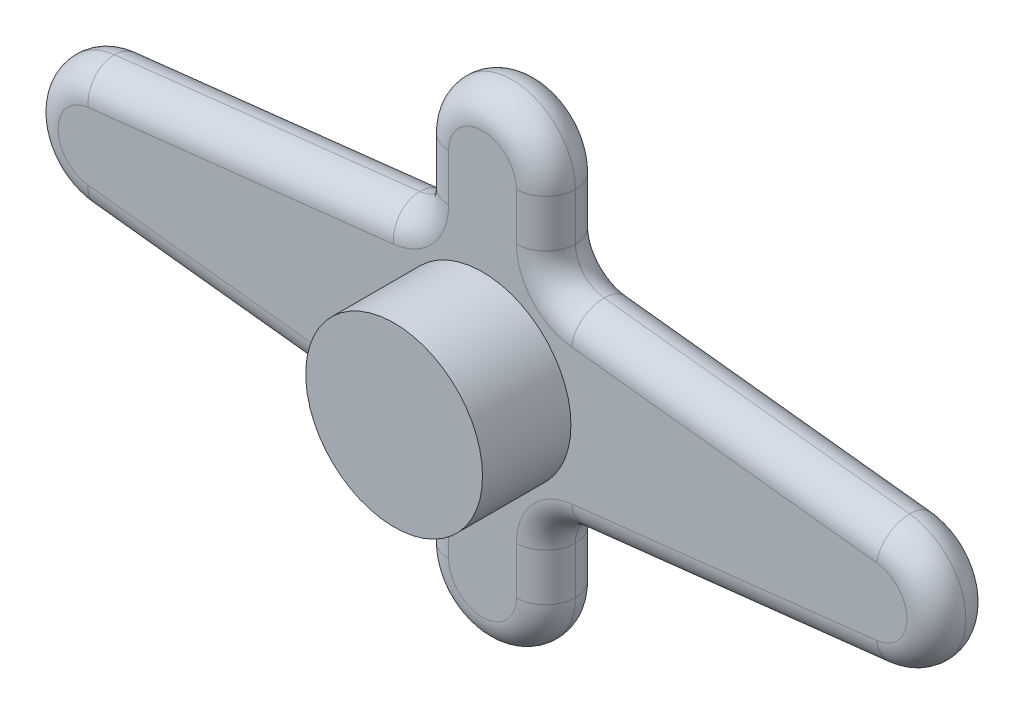
ISO-10303-21;
HEADER;
FILE_DESCRIPTION(('STEP AP214'),'2;1');
FILE_NAME('part.step','',(''),(''),'','','');
FILE_SCHEMA(('AUTOMOTIVE_DESIGN { 1 0 10303 214 1 1 1 1 }'));
ENDSEC;
DATA;
#1=APPLICATION_CONTEXT('core data for automotive mechanical design processes');
#2=APPLICATION_PROTOCOL_DEFINITION('international standard','automotive_design',2000,#1);
#3=PRODUCT_CONTEXT('',#1,'mechanical');
#4=PRODUCT('Part','Part','',(#3));
#5=PRODUCT_RELATED_PRODUCT_CATEGORY('part','',(#4));
#6=PRODUCT_DEFINITION_FORMATION('','',#4);
#7=PRODUCT_DEFINITION_CONTEXT('part definition',#1,'design');
#8=PRODUCT_DEFINITION('design','',#6,#7);
#9=PRODUCT_DEFINITION_SHAPE('','',#8);
#10=(LENGTH_UNIT() NAMED_UNIT(*) SI_UNIT(.MILLI.,.METRE.));
#11=(NAMED_UNIT(*) PLANE_ANGLE_UNIT() SI_UNIT($,.RADIAN.));
#12=(NAMED_UNIT(*) SI_UNIT($,.STERADIAN.) SOLID_ANGLE_UNIT());
#13=UNCERTAINTY_MEASURE_WITH_UNIT(LENGTH_MEASURE(1.E-05),#10,'distance_accuracy_value','');
#14=(GEOMETRIC_REPRESENTATION_CONTEXT(3) GLOBAL_UNCERTAINTY_ASSIGNED_CONTEXT((#13)) GLOBAL_UNIT_ASSIGNED_CONTEXT((#10,
#11,#12)) REPRESENTATION_CONTEXT('',''));
#15=CARTESIAN_POINT('',(0.,0.,0.));
#16=DIRECTION('',(0.,0.,1.));
#17=DIRECTION('',(1.,0.,0.));
#18=AXIS2_PLACEMENT_3D('',#15,#16,#17);
#19=CARTESIAN_POINT('',(675.133867879121,870.80410708692,1309.67784345282));
#20=DIRECTION('',(0.,0.,1.));
#21=DIRECTION('',(1.,0.,0.));
#22=AXIS2_PLACEMENT_3D('',#19,#20,#21);
#23=PLANE('',#22);
#24=DIRECTION('',(-9.12479080608965E-12,-1.,0.));
#25=VECTOR('',#24,1.);
#26=CARTESIAN_POINT('',(677.233867878965,879.591990943889,1309.67784345282));
#27=LINE('',#26,#25);
#28=CARTESIAN_POINT('',(677.233867878979,881.198049015409,1309.67784345282));
#29=VERTEX_POINT('',#28);
#30=CARTESIAN_POINT('',(677.233867878965,879.591990943909,1309.67784345282));
#31=VERTEX_POINT('',#30);
#32=EDGE_CURVE('E354',#29,#31,#27,.T.);
#33=ORIENTED_EDGE('',*,*,#32,.T.);
#34=CARTESIAN_POINT('',(675.133867879001,879.591990943886,1309.67784345282));
#35=DIRECTION('',(0.,0.,1.));
#36=DIRECTION('',(1.,0.,0.));
#37=AXIS2_PLACEMENT_3D('',#34,#35,#36);
#38=CIRCLE('',#37,2.09999999997242);
#39=CARTESIAN_POINT('',(675.368326717869,877.50512030755,1309.67784345282));
#40=VERTEX_POINT('',#39);
#41=EDGE_CURVE('E356',#31,#40,#38,.F.);
#42=ORIENTED_EDGE('',*,*,#41,.T.);
#43=DIRECTION('',(-0.993747922073089,-0.111647066129911,0.));
#44=VECTOR('',#43,1.);
#45=CARTESIAN_POINT('',(665.005473753016,876.340859125652,1309.67784345282));
#46=LINE('',#45,#44);
#47=CARTESIAN_POINT('',(665.005473753014,876.340859125652,1309.67784345282));
#48=VERTEX_POINT('',#47);
#49=EDGE_CURVE('E324',#40,#48,#46,.T.);
#50=ORIENTED_EDGE('',*,*,#49,.T.);
#51=CARTESIAN_POINT('',(665.133867879061,875.198049015267,1309.67784345282));
#52=DIRECTION('',(0.,0.,1.));
#53=DIRECTION('',(1.,0.,0.));
#54=AXIS2_PLACEMENT_3D('',#51,#52,#53);
#55=CIRCLE('',#54,1.15000000000018);
#56=CARTESIAN_POINT('',(665.005473753045,874.055238904879,1309.67784345282));
#57=VERTEX_POINT('',#56);
#58=EDGE_CURVE('E328',#48,#57,#55,.T.);
#59=ORIENTED_EDGE('',*,*,#58,.T.);
#60=DIRECTION('',(0.993747922076312,-0.111647066101228,0.));
#61=VECTOR('',#60,1.);
#62=CARTESIAN_POINT('',(675.368326717933,872.89097772328,1309.67784345282));
#63=LINE('',#62,#61);
#64=CARTESIAN_POINT('',(675.368326717933,872.89097772328,1309.67784345282));
#65=VERTEX_POINT('',#64);
#66=EDGE_CURVE('E330',#57,#65,#63,.T.);
#67=ORIENTED_EDGE('',*,*,#66,.T.);
#68=CARTESIAN_POINT('',(675.133867879121,870.80410708692,1309.67784345282));
#69=DIRECTION('',(0.,0.,1.));
#70=DIRECTION('',(1.,0.,0.));
#71=AXIS2_PLACEMENT_3D('',#68,#69,#70);
#72=CIRCLE('',#71,2.10000000000007);
#73=CARTESIAN_POINT('',(677.233867879121,870.804107086948,1309.67784345282));
#74=VERTEX_POINT('',#73);
#75=EDGE_CURVE('E332',#65,#74,#72,.F.);
#76=ORIENTED_EDGE('',*,*,#75,.T.);
#77=DIRECTION('',(1.32724229907015E-11,-1.,0.));
#78=VECTOR('',#77,1.);
#79=CARTESIAN_POINT('',(677.233867879142,869.198049015431,1309.67784345282));
#80=LINE('',#79,#78);
#81=CARTESIAN_POINT('',(677.233867879142,869.198049015431,1309.67784345282));
#82=VERTEX_POINT('',#81);
#83=EDGE_CURVE('E334',#74,#82,#80,.T.);
#84=ORIENTED_EDGE('',*,*,#83,.T.);
#85=CARTESIAN_POINT('',(678.383867879142,869.198049015447,1309.67784345282));
#86=DIRECTION('',(0.,0.,1.));
#87=DIRECTION('',(1.,0.,0.));
#88=AXIS2_PLACEMENT_3D('',#85,#86,#87);
#89=CIRCLE('',#88,1.1500000000001);
#90=CARTESIAN_POINT('',(679.533867879142,869.198049015468,1309.67784345282));
#91=VERTEX_POINT('',#90);
#92=EDGE_CURVE('E336',#82,#91,#89,.T.);
#93=ORIENTED_EDGE('',*,*,#92,.T.);
#94=DIRECTION('',(-7.88050115068328E-12,1.,0.));
#95=VECTOR('',#94,1.);
#96=CARTESIAN_POINT('',(679.53386787913,870.804107086994,1309.67784345282));
#97=LINE('',#96,#95);
#98=CARTESIAN_POINT('',(679.53386787913,870.804107086997,1309.67784345282));
#99=VERTEX_POINT('',#98);
#100=EDGE_CURVE('E338',#91,#99,#97,.T.);
#101=ORIENTED_EDGE('',*,*,#100,.T.);
#102=CARTESIAN_POINT('',(681.63386787912,870.804107087007,1309.67784345282));
#103=DIRECTION('',(0.,0.,1.));
#104=DIRECTION('',(1.,0.,0.));
#105=AXIS2_PLACEMENT_3D('',#102,#103,#104);
#106=CIRCLE('',#105,2.09999999999465);
#107=CARTESIAN_POINT('',(681.39940904028,872.890977723359,1309.67784345282));
#108=VERTEX_POINT('',#107);
#109=EDGE_CURVE('E340',#99,#108,#106,.F.);
#110=ORIENTED_EDGE('',*,*,#109,.T.);
#111=DIRECTION('',(0.993747922073295,0.11164706612808,0.));
#112=VECTOR('',#111,1.);
#113=CARTESIAN_POINT('',(691.762262005108,874.055238905239,1309.67784345282));
#114=LINE('',#113,#112);
#115=CARTESIAN_POINT('',(691.762262005109,874.055238905239,1309.67784345282));
#116=VERTEX_POINT('',#115);
#117=EDGE_CURVE('E342',#108,#116,#114,.T.);
#118=ORIENTED_EDGE('',*,*,#117,.T.);
#119=CARTESIAN_POINT('',(691.633867879061,875.198049015623,1309.67784345282));
#120=DIRECTION('',(0.,0.,1.));
#121=DIRECTION('',(1.,0.,0.));
#122=AXIS2_PLACEMENT_3D('',#119,#120,#121);
#123=CIRCLE('',#122,1.15000000000016);
#124=CARTESIAN_POINT('',(691.762262005078,876.340859126011,1309.67784345282));
#125=VERTEX_POINT('',#124);
#126=EDGE_CURVE('E344',#116,#125,#123,.T.);
#127=ORIENTED_EDGE('',*,*,#126,.T.);
#128=DIRECTION('',(-0.993747922076275,0.111647066101561,0.));
#129=VECTOR('',#128,1.);
#130=CARTESIAN_POINT('',(681.399409040212,877.505120307611,1309.67784345282));
#131=LINE('',#130,#129);
#132=CARTESIAN_POINT('',(681.399409040233,877.505120307609,1309.67784345282));
#133=VERTEX_POINT('',#132);
#134=EDGE_CURVE('E346',#125,#133,#131,.T.);
#135=ORIENTED_EDGE('',*,*,#134,.T.);
#136=CARTESIAN_POINT('',(681.633867879002,879.591990943973,1309.67784345282));
#137=DIRECTION('',(0.,0.,1.));
#138=DIRECTION('',(1.,0.,0.));
#139=AXIS2_PLACEMENT_3D('',#136,#137,#138);
#140=CIRCLE('',#139,2.09999999999912);
#141=CARTESIAN_POINT('',(679.533867879003,879.591990943943,1309.67784345282));
#142=VERTEX_POINT('',#141);
#143=EDGE_CURVE('E348',#133,#142,#140,.F.);
#144=ORIENTED_EDGE('',*,*,#143,.T.);
#145=DIRECTION('',(-1.45167126460658E-11,1.,0.));
#146=VECTOR('',#145,1.);
#147=CARTESIAN_POINT('',(679.533867878979,881.198049015461,1309.67784345282));
#148=LINE('',#147,#146);
#149=CARTESIAN_POINT('',(679.533867878979,881.198049015462,1309.67784345282));
#150=VERTEX_POINT('',#149);
#151=EDGE_CURVE('E350',#142,#150,#148,.T.);
#152=ORIENTED_EDGE('',*,*,#151,.T.);
#153=CARTESIAN_POINT('',(678.383867878979,881.198049015447,1309.67784345282));
#154=DIRECTION('',(0.,0.,1.));
#155=DIRECTION('',(1.,0.,0.));
#156=AXIS2_PLACEMENT_3D('',#153,#154,#155);
#157=CIRCLE('',#156,1.1500000000001);
#158=EDGE_CURVE('E352',#150,#29,#157,.T.);
#159=ORIENTED_EDGE('',*,*,#158,.T.);
#160=EDGE_LOOP('',(#33,#42,#50,#59,#67,#76,#84,#93,#101,#110,#118,#127,#135,#144,#152,#159));
#161=FACE_BOUND('',#160,.T.);
#162=CARTESIAN_POINT('',(678.383867879061,875.198049015447,1309.67784345282));
#163=DIRECTION('',(0.,0.,1.));
#164=DIRECTION('',(1.,0.,0.));
#165=AXIS2_PLACEMENT_3D('',#162,#163,#164);
#166=CIRCLE('',#165,3.00000000000005);
#167=CARTESIAN_POINT('',(681.383867879061,875.198049015447,1309.67784345282));
#168=VERTEX_POINT('',#167);
#169=EDGE_CURVE('E319',#168,#168,#166,.T.);
#170=ORIENTED_EDGE('',*,*,#169,.F.);
#171=EDGE_LOOP('',(#170));
#172=FACE_BOUND('',#171,.T.);
#173=ADVANCED_FACE('F39',(#161,#172),#23,.T.);
#174=CARTESIAN_POINT('',(675.133867879121,870.80410708692,1307.67784345282));
#175=DIRECTION('',(0.,0.,1.));
#176=DIRECTION('',(1.,0.,0.));
#177=AXIS2_PLACEMENT_3D('',#174,#175,#176);
#178=PLANE('',#177);
#179=DIRECTION('',(-0.993747922073089,-0.111647066129911,0.));
#180=VECTOR('',#179,1.);
#181=CARTESIAN_POINT('',(674.393319440673,877.395578743199,1307.67784345282));
#182=LINE('',#181,#180);
#183=CARTESIAN_POINT('',(665.005473753014,876.340859125652,1307.67784345282));
#184=VERTEX_POINT('',#183);
#185=CARTESIAN_POINT('',(675.368326717869,877.50512030755,1307.67784345282));
#186=VERTEX_POINT('',#185);
#187=EDGE_CURVE('E359',#184,#186,#182,.F.);
#188=ORIENTED_EDGE('',*,*,#187,.T.);
#189=CARTESIAN_POINT('',(675.133867879001,879.591990943886,1307.67784345282));
#190=DIRECTION('',(0.,0.,1.));
#191=DIRECTION('',(1.,0.,0.));
#192=AXIS2_PLACEMENT_3D('',#189,#190,#191);
#193=CIRCLE('',#192,2.09999999997242);
#194=CARTESIAN_POINT('',(677.233867878965,879.591990943909,1307.67784345282));
#195=VERTEX_POINT('',#194);
#196=EDGE_CURVE('E11',#186,#195,#193,.T.);
#197=ORIENTED_EDGE('',*,*,#196,.T.);
#198=DIRECTION('',(-9.12479080608965E-12,-1.,0.));
#199=VECTOR('',#198,1.);
#200=CARTESIAN_POINT('',(677.233867878884,870.804107086901,1307.67784345282));
#201=LINE('',#200,#199);
#202=CARTESIAN_POINT('',(677.233867878979,881.198049015409,1307.67784345282));
#203=VERTEX_POINT('',#202);
#204=EDGE_CURVE('E49',#195,#203,#201,.F.);
#205=ORIENTED_EDGE('',*,*,#204,.T.);
#206=CARTESIAN_POINT('',(678.383867878979,881.198049015447,1307.67784345282));
#207=DIRECTION('',(0.,0.,1.));
#208=DIRECTION('',(1.,0.,0.));
#209=AXIS2_PLACEMENT_3D('',#206,#207,#208);
#210=CIRCLE('',#209,1.1500000000001);
#211=CARTESIAN_POINT('',(679.533867878979,881.198049015462,1307.67784345282));
#212=VERTEX_POINT('',#211);
#213=EDGE_CURVE('E211',#203,#212,#210,.F.);
#214=ORIENTED_EDGE('',*,*,#213,.T.);
#215=DIRECTION('',(-1.45167126460658E-11,1.,0.));
#216=VECTOR('',#215,1.);
#217=CARTESIAN_POINT('',(679.53386787913,870.804107086984,1307.67784345282));
#218=LINE('',#217,#216);
#219=CARTESIAN_POINT('',(679.533867879003,879.591990943943,1307.67784345282));
#220=VERTEX_POINT('',#219);
#221=EDGE_CURVE('E214',#212,#220,#218,.F.);
#222=ORIENTED_EDGE('',*,*,#221,.T.);
#223=CARTESIAN_POINT('',(681.633867879002,879.591990943973,1307.67784345282));
#224=DIRECTION('',(0.,0.,1.));
#225=DIRECTION('',(1.,0.,0.));
#226=AXIS2_PLACEMENT_3D('',#223,#224,#225);
#227=CIRCLE('',#226,2.09999999999912);
#228=CARTESIAN_POINT('',(681.399409040233,877.505120307609,1307.67784345282));
#229=VERTEX_POINT('',#228);
#230=EDGE_CURVE('E227',#220,#229,#227,.T.);
#231=ORIENTED_EDGE('',*,*,#230,.T.);
#232=DIRECTION('',(-0.993747922076275,0.111647066101561,0.));
#233=VECTOR('',#232,1.);
#234=CARTESIAN_POINT('',(675.955439255287,878.116747502929,1307.67784345282));
#235=LINE('',#234,#233);
#236=CARTESIAN_POINT('',(691.762262005078,876.340859126011,1307.67784345282));
#237=VERTEX_POINT('',#236);
#238=EDGE_CURVE('E379',#229,#237,#235,.F.);
#239=ORIENTED_EDGE('',*,*,#238,.T.);
#240=CARTESIAN_POINT('',(691.633867879061,875.198049015623,1307.67784345282));
#241=DIRECTION('',(0.,0.,1.));
#242=DIRECTION('',(1.,0.,0.));
#243=AXIS2_PLACEMENT_3D('',#240,#241,#242);
#244=CIRCLE('',#243,1.15000000000016);
#245=CARTESIAN_POINT('',(691.762262005109,874.055238905239,1307.67784345282));
#246=VERTEX_POINT('',#245);
#247=EDGE_CURVE('E377',#237,#246,#244,.F.);
#248=ORIENTED_EDGE('',*,*,#247,.T.);
#249=DIRECTION('',(0.993747922073295,0.11164706612808,0.));
#250=VECTOR('',#249,1.);
#251=CARTESIAN_POINT('',(674.98043197818,872.169808963551,1307.67784345282));
#252=LINE('',#251,#250);
#253=CARTESIAN_POINT('',(681.39940904028,872.890977723359,1307.67784345282));
#254=VERTEX_POINT('',#253);
#255=EDGE_CURVE('E375',#246,#254,#252,.F.);
#256=ORIENTED_EDGE('',*,*,#255,.T.);
#257=CARTESIAN_POINT('',(681.63386787912,870.804107087007,1307.67784345282));
#258=DIRECTION('',(0.,0.,1.));
#259=DIRECTION('',(1.,0.,0.));
#260=AXIS2_PLACEMENT_3D('',#257,#258,#259);
#261=CIRCLE('',#260,2.09999999999465);
#262=CARTESIAN_POINT('',(679.53386787913,870.804107086997,1307.67784345282));
#263=VERTEX_POINT('',#262);
#264=EDGE_CURVE('E373',#254,#263,#261,.T.);
#265=ORIENTED_EDGE('',*,*,#264,.T.);
#266=DIRECTION('',(-7.88050115068328E-12,1.,0.));
#267=VECTOR('',#266,1.);
#268=CARTESIAN_POINT('',(679.53386787913,870.804107086955,1307.67784345282));
#269=LINE('',#268,#267);
#270=CARTESIAN_POINT('',(679.533867879142,869.198049015468,1307.67784345282));
#271=VERTEX_POINT('',#270);
#272=EDGE_CURVE('E371',#263,#271,#269,.F.);
#273=ORIENTED_EDGE('',*,*,#272,.T.);
#274=CARTESIAN_POINT('',(678.383867879142,869.198049015447,1307.67784345282));
#275=DIRECTION('',(0.,0.,1.));
#276=DIRECTION('',(1.,0.,0.));
#277=AXIS2_PLACEMENT_3D('',#274,#275,#276);
#278=CIRCLE('',#277,1.1500000000001);
#279=CARTESIAN_POINT('',(677.233867879142,869.198049015431,1307.67784345282));
#280=VERTEX_POINT('',#279);
#281=EDGE_CURVE('E369',#271,#280,#278,.F.);
#282=ORIENTED_EDGE('',*,*,#281,.T.);
#283=DIRECTION('',(1.32724229907015E-11,-1.,0.));
#284=VECTOR('',#283,1.);
#285=CARTESIAN_POINT('',(677.233867879121,870.804107086948,1307.67784345282));
#286=LINE('',#285,#284);
#287=CARTESIAN_POINT('',(677.233867879121,870.804107086948,1307.67784345282));
#288=VERTEX_POINT('',#287);
#289=EDGE_CURVE('E367',#280,#288,#286,.F.);
#290=ORIENTED_EDGE('',*,*,#289,.T.);
#291=CARTESIAN_POINT('',(675.133867879121,870.80410708692,1307.67784345282));
#292=DIRECTION('',(0.,0.,1.));
#293=DIRECTION('',(1.,0.,0.));
#294=AXIS2_PLACEMENT_3D('',#291,#292,#293);
#295=CIRCLE('',#294,2.10000000000007);
#296=CARTESIAN_POINT('',(675.368326717933,872.89097772328,1307.67784345282));
#297=VERTEX_POINT('',#296);
#298=EDGE_CURVE('E365',#288,#297,#295,.T.);
#299=ORIENTED_EDGE('',*,*,#298,.T.);
#300=DIRECTION('',(0.993747922076312,-0.111647066101228,0.));
#301=VECTOR('',#300,1.);
#302=CARTESIAN_POINT('',(675.368326717933,872.89097772328,1307.67784345282));
#303=LINE('',#302,#301);
#304=CARTESIAN_POINT('',(665.005473753045,874.055238904879,1307.67784345282));
#305=VERTEX_POINT('',#304);
#306=EDGE_CURVE('E363',#297,#305,#303,.F.);
#307=ORIENTED_EDGE('',*,*,#306,.T.);
#308=CARTESIAN_POINT('',(665.133867879061,875.198049015267,1307.67784345282));
#309=DIRECTION('',(0.,0.,1.));
#310=DIRECTION('',(1.,0.,0.));
#311=AXIS2_PLACEMENT_3D('',#308,#309,#310);
#312=CIRCLE('',#311,1.15000000000018);
#313=EDGE_CURVE('E361',#305,#184,#312,.F.);
#314=ORIENTED_EDGE('',*,*,#313,.T.);
#315=EDGE_LOOP('',(#188,#197,#205,#214,#222,#231,#239,#248,#256,#265,#273,#282,#290,#299,#307,#314));
#316=FACE_BOUND('',#315,.T.);
#317=ADVANCED_FACE('F213',(#316),#178,.F.);
#318=CARTESIAN_POINT('',(678.383867879061,875.198049015447,1312.67784345282));
#319=DIRECTION('',(0.,0.,-1.));
#320=DIRECTION('',(-1.,0.,0.));
#321=AXIS2_PLACEMENT_3D('',#318,#319,#320);
#322=CYLINDRICAL_SURFACE('',#321,3.00000000000005);
#323=CARTESIAN_POINT('',(678.383867879061,875.198049015447,1312.67784345282));
#324=DIRECTION('',(0.,0.,1.));
#325=DIRECTION('',(1.,0.,0.));
#326=AXIS2_PLACEMENT_3D('',#323,#324,#325);
#327=CIRCLE('',#326,3.00000000000005);
#328=CARTESIAN_POINT('',(681.383867879061,875.198049015447,1312.67784345282));
#329=VERTEX_POINT('',#328);
#330=EDGE_CURVE('E315',#329,#329,#327,.T.);
#331=ORIENTED_EDGE('',*,*,#330,.F.);
#332=EDGE_LOOP('',(#331));
#333=FACE_BOUND('',#332,.T.);
#334=ORIENTED_EDGE('',*,*,#169,.T.);
#335=EDGE_LOOP('',(#334));
#336=FACE_BOUND('',#335,.T.);
#337=ADVANCED_FACE('F524',(#333,#336),#322,.T.);
#338=CARTESIAN_POINT('',(678.383867879061,875.198049015447,1312.67784345282));
#339=DIRECTION('',(0.,0.,1.));
#340=DIRECTION('',(1.,0.,0.));
#341=AXIS2_PLACEMENT_3D('',#338,#339,#340);
#342=PLANE('',#341);
#343=ORIENTED_EDGE('',*,*,#330,.T.);
#344=EDGE_LOOP('',(#343));
#345=FACE_BOUND('',#344,.T.);
#346=ADVANCED_FACE('F761',(#345),#342,.T.);
#347=CARTESIAN_POINT('',(681.63386787912,870.804107087007,1308.67784345282));
#348=DIRECTION('',(0.,0.,1.));
#349=DIRECTION('',(1.,0.,0.));
#350=AXIS2_PLACEMENT_3D('',#347,#348,#349);
#351=TOROIDAL_SURFACE('',#350,2.09999999999465,1.);
#352=CARTESIAN_POINT('',(679.533867879126,870.804107086997,1308.67784345282));
#353=DIRECTION('',(4.77395900588817E-12,-1.,0.));
#354=DIRECTION('',(1.,4.77395900588817E-12,0.));
#355=AXIS2_PLACEMENT_3D('',#352,#353,#354);
#356=CIRCLE('',#355,1.);
#357=CARTESIAN_POINT('',(680.53386787913,870.804107087002,1308.67784345282));
#358=VERTEX_POINT('',#357);
#359=EDGE_CURVE('E310',#263,#358,#356,.T.);
#360=ORIENTED_EDGE('',*,*,#359,.F.);
#361=ORIENTED_EDGE('',*,*,#264,.F.);
#362=CARTESIAN_POINT('',(681.399409040305,872.890977723362,1308.67784345282));
#363=DIRECTION('',(0.99374792207615,0.111647066102668,-2.55874319370501E-11));
#364=DIRECTION('',(-0.111647066102668,0.99374792207615,0.));
#365=AXIS2_PLACEMENT_3D('',#362,#363,#364);
#366=CIRCLE('',#365,1.);
#367=CARTESIAN_POINT('',(681.511056106408,871.89722980129,1308.67784345282));
#368=VERTEX_POINT('',#367);
#369=EDGE_CURVE('E43',#368,#254,#366,.T.);
#370=ORIENTED_EDGE('',*,*,#369,.F.);
#371=CARTESIAN_POINT('',(681.63386787912,870.804107087007,1308.67784345282));
#372=DIRECTION('',(0.,0.,1.));
#373=DIRECTION('',(1.,0.,0.));
#374=AXIS2_PLACEMENT_3D('',#371,#372,#373);
#375=CIRCLE('',#374,1.09999999999465);
#376=EDGE_CURVE('E111',#358,#368,#375,.F.);
#377=ORIENTED_EDGE('',*,*,#376,.F.);
#378=EDGE_LOOP('',(#360,#361,#370,#377));
#379=FACE_BOUND('',#378,.T.);
#380=ADVANCED_FACE('F41',(#379),#351,.T.);
#381=CARTESIAN_POINT('',(681.399409040279,872.890977723363,1308.67784345282));
#382=DIRECTION('',(0.993747922073295,0.11164706612808,0.));
#383=DIRECTION('',(-0.11164706612808,0.993747922073295,0.));
#384=AXIS2_PLACEMENT_3D('',#381,#382,#383);
#385=CYLINDRICAL_SURFACE('',#384,1.);
#386=ORIENTED_EDGE('',*,*,#369,.T.);
#387=ORIENTED_EDGE('',*,*,#255,.F.);
#388=CARTESIAN_POINT('',(691.762262005108,874.055238905239,1308.67784345282));
#389=DIRECTION('',(0.993747922073294,0.111647066128095,2.2065636475186E-13));
#390=DIRECTION('',(-0.111647066128095,0.993747922073294,0.));
#391=AXIS2_PLACEMENT_3D('',#388,#389,#390);
#392=CIRCLE('',#391,1.);
#393=CARTESIAN_POINT('',(691.873909071236,873.061490983166,1308.67784345282));
#394=VERTEX_POINT('',#393);
#395=EDGE_CURVE('E307',#394,#246,#392,.T.);
#396=ORIENTED_EDGE('',*,*,#395,.F.);
#397=DIRECTION('',(0.993747922073295,0.11164706612808,0.));
#398=VECTOR('',#397,1.);
#399=CARTESIAN_POINT('',(681.511056106408,871.89722980129,1308.67784345282));
#400=LINE('',#399,#398);
#401=EDGE_CURVE('E304',#368,#394,#400,.T.);
#402=ORIENTED_EDGE('',*,*,#401,.F.);
#403=EDGE_LOOP('',(#386,#387,#396,#402));
#404=FACE_BOUND('',#403,.T.);
#405=ADVANCED_FACE('F456',(#404),#385,.T.);
#406=CARTESIAN_POINT('',(681.63386787912,870.804107087007,1308.67784345282));
#407=DIRECTION('',(0.,0.,1.));
#408=DIRECTION('',(1.,0.,0.));
#409=AXIS2_PLACEMENT_3D('',#406,#407,#408);
#410=TOROIDAL_SURFACE('',#409,2.09999999999465,1.);
#411=CARTESIAN_POINT('',(679.533867879126,870.804107086997,1308.67784345282));
#412=DIRECTION('',(4.77395900588817E-12,-1.,0.));
#413=DIRECTION('',(1.,4.77395900588817E-12,0.));
#414=AXIS2_PLACEMENT_3D('',#411,#412,#413);
#415=CIRCLE('',#414,1.);
#416=EDGE_CURVE('E298',#358,#99,#415,.T.);
#417=ORIENTED_EDGE('',*,*,#416,.F.);
#418=ORIENTED_EDGE('',*,*,#376,.T.);
#419=CARTESIAN_POINT('',(681.39940904028,872.890977723359,1308.67784345282));
#420=DIRECTION('',(0.993747922073294,0.111647066128095,0.));
#421=DIRECTION('',(-0.111647066128095,0.993747922073294,0.));
#422=AXIS2_PLACEMENT_3D('',#419,#420,#421);
#423=CIRCLE('',#422,1.);
#424=EDGE_CURVE('E301',#108,#368,#423,.T.);
#425=ORIENTED_EDGE('',*,*,#424,.F.);
#426=ORIENTED_EDGE('',*,*,#109,.F.);
#427=EDGE_LOOP('',(#417,#418,#425,#426));
#428=FACE_BOUND('',#427,.T.);
#429=ADVANCED_FACE('F740',(#428),#410,.T.);
#430=CARTESIAN_POINT('',(679.533867879142,869.198049015468,1308.67784345282));
#431=DIRECTION('',(-7.88050115068328E-12,1.,0.));
#432=DIRECTION('',(-1.,-7.88050115068328E-12,0.));
#433=AXIS2_PLACEMENT_3D('',#430,#431,#432);
#434=CYLINDRICAL_SURFACE('',#433,1.);
#435=ORIENTED_EDGE('',*,*,#272,.F.);
#436=ORIENTED_EDGE('',*,*,#359,.T.);
#437=DIRECTION('',(-7.88050115068328E-12,1.,0.));
#438=VECTOR('',#437,1.);
#439=CARTESIAN_POINT('',(680.533867879142,869.198049015476,1308.67784345282));
#440=LINE('',#439,#438);
#441=CARTESIAN_POINT('',(680.533867879142,869.198049015476,1308.67784345282));
#442=VERTEX_POINT('',#441);
#443=EDGE_CURVE('E295',#442,#358,#440,.T.);
#444=ORIENTED_EDGE('',*,*,#443,.F.);
#445=CARTESIAN_POINT('',(679.533867879142,869.198049015468,1308.67784345282));
#446=DIRECTION('',(7.8825834748386E-12,-1.,0.));
#447=DIRECTION('',(1.,7.8825834748386E-12,0.));
#448=AXIS2_PLACEMENT_3D('',#445,#446,#447);
#449=CIRCLE('',#448,1.);
#450=EDGE_CURVE('E292',#271,#442,#449,.T.);
#451=ORIENTED_EDGE('',*,*,#450,.F.);
#452=EDGE_LOOP('',(#435,#436,#444,#451));
#453=FACE_BOUND('',#452,.T.);
#454=ADVANCED_FACE('F460',(#453),#434,.T.);
#455=CARTESIAN_POINT('',(691.633867879061,875.198049015623,1308.67784345282));
#456=DIRECTION('',(0.,0.,1.));
#457=DIRECTION('',(1.,0.,0.));
#458=AXIS2_PLACEMENT_3D('',#455,#456,#457);
#459=TOROIDAL_SURFACE('',#458,1.15000000000016,1.);
#460=ORIENTED_EDGE('',*,*,#395,.T.);
#461=ORIENTED_EDGE('',*,*,#247,.F.);
#462=CARTESIAN_POINT('',(691.762262005078,876.340859126011,1308.67784345282));
#463=DIRECTION('',(-0.993747922076299,0.11164706610134,2.33051679094284E-13));
#464=DIRECTION('',(-0.11164706610134,-0.9937479220763,0.));
#465=AXIS2_PLACEMENT_3D('',#462,#463,#464);
#466=CIRCLE('',#465,1.);
#467=CARTESIAN_POINT('',(691.873909071179,877.334607048088,1308.67784345282));
#468=VERTEX_POINT('',#467);
#469=EDGE_CURVE('E289',#468,#237,#466,.T.);
#470=ORIENTED_EDGE('',*,*,#469,.F.);
#471=CARTESIAN_POINT('',(691.633867879061,875.198049015623,1308.67784345282));
#472=DIRECTION('',(0.,0.,1.));
#473=DIRECTION('',(1.,0.,0.));
#474=AXIS2_PLACEMENT_3D('',#471,#472,#473);
#475=CIRCLE('',#474,2.15000000000016);
#476=EDGE_CURVE('E286',#394,#468,#475,.T.);
#477=ORIENTED_EDGE('',*,*,#476,.F.);
#478=EDGE_LOOP('',(#460,#461,#470,#477));
#479=FACE_BOUND('',#478,.T.);
#480=ADVANCED_FACE('F446',(#479),#459,.T.);
#481=CARTESIAN_POINT('',(674.98043197818,872.169808963551,1308.67784345282));
#482=DIRECTION('',(-0.993747922073295,-0.11164706612808,0.));
#483=DIRECTION('',(0.11164706612808,-0.993747922073295,0.));
#484=AXIS2_PLACEMENT_3D('',#481,#482,#483);
#485=CYLINDRICAL_SURFACE('',#484,1.);
#486=ORIENTED_EDGE('',*,*,#424,.T.);
#487=ORIENTED_EDGE('',*,*,#401,.T.);
#488=CARTESIAN_POINT('',(691.762262005109,874.055238905239,1308.67784345282));
#489=DIRECTION('',(0.993747922073318,0.111647066127876,0.));
#490=DIRECTION('',(-0.111647066127876,0.993747922073318,0.));
#491=AXIS2_PLACEMENT_3D('',#488,#489,#490);
#492=CIRCLE('',#491,1.);
#493=EDGE_CURVE('E283',#116,#394,#492,.T.);
#494=ORIENTED_EDGE('',*,*,#493,.F.);
#495=ORIENTED_EDGE('',*,*,#117,.F.);
#496=EDGE_LOOP('',(#486,#487,#494,#495));
#497=FACE_BOUND('',#496,.T.);
#498=ADVANCED_FACE('F455',(#497),#485,.T.);
#499=CARTESIAN_POINT('',(679.53386787913,870.804107086955,1308.67784345282));
#500=DIRECTION('',(7.88050115068328E-12,-1.,0.));
#501=DIRECTION('',(1.,7.88050115068328E-12,0.));
#502=AXIS2_PLACEMENT_3D('',#499,#500,#501);
#503=CYLINDRICAL_SURFACE('',#502,1.);
#504=ORIENTED_EDGE('',*,*,#416,.T.);
#505=ORIENTED_EDGE('',*,*,#100,.F.);
#506=CARTESIAN_POINT('',(679.533867879142,869.198049015468,1308.67784345282));
#507=DIRECTION('',(7.8825834748386E-12,-1.,0.));
#508=DIRECTION('',(1.,7.8825834748386E-12,0.));
#509=AXIS2_PLACEMENT_3D('',#506,#507,#508);
#510=CIRCLE('',#509,1.);
#511=EDGE_CURVE('E280',#442,#91,#510,.T.);
#512=ORIENTED_EDGE('',*,*,#511,.F.);
#513=ORIENTED_EDGE('',*,*,#443,.T.);
#514=EDGE_LOOP('',(#504,#505,#512,#513));
#515=FACE_BOUND('',#514,.T.);
#516=ADVANCED_FACE('F710',(#515),#503,.T.);
#517=CARTESIAN_POINT('',(678.383867879142,869.198049015447,1308.67784345282));
#518=DIRECTION('',(0.,0.,1.));
#519=DIRECTION('',(1.,0.,0.));
#520=AXIS2_PLACEMENT_3D('',#517,#518,#519);
#521=TOROIDAL_SURFACE('',#520,1.1500000000001,1.);
#522=ORIENTED_EDGE('',*,*,#281,.F.);
#523=ORIENTED_EDGE('',*,*,#450,.T.);
#524=CARTESIAN_POINT('',(678.383867879142,869.198049015447,1308.67784345282));
#525=DIRECTION('',(0.,0.,1.));
#526=DIRECTION('',(1.,0.,0.));
#527=AXIS2_PLACEMENT_3D('',#524,#525,#526);
#528=CIRCLE('',#527,2.1500000000001);
#529=CARTESIAN_POINT('',(676.233867879142,869.198049015418,1308.67784345282));
#530=VERTEX_POINT('',#529);
#531=EDGE_CURVE('E277',#530,#442,#528,.T.);
#532=ORIENTED_EDGE('',*,*,#531,.F.);
#533=CARTESIAN_POINT('',(677.233867879142,869.198049015431,1308.67784345282));
#534=DIRECTION('',(-1.35447209004269E-11,1.,0.));
#535=DIRECTION('',(-1.,-1.35447209004269E-11,0.));
#536=AXIS2_PLACEMENT_3D('',#533,#534,#535);
#537=CIRCLE('',#536,1.);
#538=EDGE_CURVE('E274',#280,#530,#537,.T.);
#539=ORIENTED_EDGE('',*,*,#538,.F.);
#540=EDGE_LOOP('',(#522,#523,#532,#539));
#541=FACE_BOUND('',#540,.T.);
#542=ADVANCED_FACE('F466',(#541),#521,.T.);
#543=CARTESIAN_POINT('',(691.762262005078,876.340859126011,1308.67784345282));
#544=DIRECTION('',(-0.993747922076275,0.111647066101561,0.));
#545=DIRECTION('',(-0.111647066101561,-0.993747922076275,0.));
#546=AXIS2_PLACEMENT_3D('',#543,#544,#545);
#547=CYLINDRICAL_SURFACE('',#546,1.);
#548=ORIENTED_EDGE('',*,*,#469,.T.);
#549=ORIENTED_EDGE('',*,*,#238,.F.);
#550=CARTESIAN_POINT('',(681.399409040212,877.505120307611,1308.67784345282));
#551=DIRECTION('',(-0.993747922076275,0.111647066101559,-2.11123280702907E-11));
#552=DIRECTION('',(-0.111647066101559,-0.993747922076275,0.));
#553=AXIS2_PLACEMENT_3D('',#550,#551,#552);
#554=CIRCLE('',#553,1.);
#555=CARTESIAN_POINT('',(681.511056106314,878.498868229687,1308.67784345282));
#556=VERTEX_POINT('',#555);
#557=EDGE_CURVE('E271',#556,#229,#554,.T.);
#558=ORIENTED_EDGE('',*,*,#557,.F.);
#559=DIRECTION('',(-0.993747922076275,0.111647066101561,0.));
#560=VECTOR('',#559,1.);
#561=CARTESIAN_POINT('',(691.873909071179,877.334607048088,1308.67784345282));
#562=LINE('',#561,#560);
#563=EDGE_CURVE('E268',#468,#556,#562,.T.);
#564=ORIENTED_EDGE('',*,*,#563,.F.);
#565=EDGE_LOOP('',(#548,#549,#558,#564));
#566=FACE_BOUND('',#565,.T.);
#567=ADVANCED_FACE('F442',(#566),#547,.T.);
#568=CARTESIAN_POINT('',(691.633867879061,875.198049015623,1308.67784345282));
#569=DIRECTION('',(0.,0.,1.));
#570=DIRECTION('',(1.,0.,0.));
#571=AXIS2_PLACEMENT_3D('',#568,#569,#570);
#572=TOROIDAL_SURFACE('',#571,1.15000000000016,1.);
#573=ORIENTED_EDGE('',*,*,#493,.T.);
#574=ORIENTED_EDGE('',*,*,#476,.T.);
#575=CARTESIAN_POINT('',(691.762262005078,876.340859126011,1308.67784345282));
#576=DIRECTION('',(-0.993747922076274,0.111647066101571,0.));
#577=DIRECTION('',(-0.111647066101571,-0.993747922076274,0.));
#578=AXIS2_PLACEMENT_3D('',#575,#576,#577);
#579=CIRCLE('',#578,1.);
#580=EDGE_CURVE('E265',#125,#468,#579,.T.);
#581=ORIENTED_EDGE('',*,*,#580,.F.);
#582=ORIENTED_EDGE('',*,*,#126,.F.);
#583=EDGE_LOOP('',(#573,#574,#581,#582));
#584=FACE_BOUND('',#583,.T.);
#585=ADVANCED_FACE('F449',(#584),#572,.T.);
#586=CARTESIAN_POINT('',(678.383867879142,869.198049015447,1308.67784345282));
#587=DIRECTION('',(0.,0.,1.));
#588=DIRECTION('',(1.,0.,0.));
#589=AXIS2_PLACEMENT_3D('',#586,#587,#588);
#590=TOROIDAL_SURFACE('',#589,1.1500000000001,1.);
#591=ORIENTED_EDGE('',*,*,#511,.T.);
#592=ORIENTED_EDGE('',*,*,#92,.F.);
#593=CARTESIAN_POINT('',(677.233867879142,869.198049015431,1308.67784345282));
#594=DIRECTION('',(-1.35447209004269E-11,1.,0.));
#595=DIRECTION('',(-1.,-1.35447209004269E-11,0.));
#596=AXIS2_PLACEMENT_3D('',#593,#594,#595);
#597=CIRCLE('',#596,1.);
#598=EDGE_CURVE('E262',#530,#82,#597,.T.);
#599=ORIENTED_EDGE('',*,*,#598,.F.);
#600=ORIENTED_EDGE('',*,*,#531,.T.);
#601=EDGE_LOOP('',(#591,#592,#599,#600));
#602=FACE_BOUND('',#601,.T.);
#603=ADVANCED_FACE('F680',(#602),#590,.T.);
#604=CARTESIAN_POINT('',(677.233867879121,870.804107086948,1308.67784345282));
#605=DIRECTION('',(1.32724229907015E-11,-1.,0.));
#606=DIRECTION('',(1.,1.32724229907015E-11,0.));
#607=AXIS2_PLACEMENT_3D('',#604,#605,#606);
#608=CYLINDRICAL_SURFACE('',#607,1.);
#609=ORIENTED_EDGE('',*,*,#289,.F.);
#610=ORIENTED_EDGE('',*,*,#538,.T.);
#611=DIRECTION('',(1.32724229907015E-11,-1.,0.));
#612=VECTOR('',#611,1.);
#613=CARTESIAN_POINT('',(676.233867879121,870.804107086935,1308.67784345282));
#614=LINE('',#613,#612);
#615=CARTESIAN_POINT('',(676.233867879121,870.804107086935,1308.67784345282));
#616=VERTEX_POINT('',#615);
#617=EDGE_CURVE('E259',#616,#530,#614,.T.);
#618=ORIENTED_EDGE('',*,*,#617,.F.);
#619=CARTESIAN_POINT('',(677.233867879121,870.804107086948,1308.67784345282));
#620=DIRECTION('',(-1.33226762955019E-11,1.,0.));
#621=DIRECTION('',(-1.,-1.33226762955019E-11,0.));
#622=AXIS2_PLACEMENT_3D('',#619,#620,#621);
#623=CIRCLE('',#622,1.);
#624=EDGE_CURVE('E256',#288,#616,#623,.T.);
#625=ORIENTED_EDGE('',*,*,#624,.F.);
#626=EDGE_LOOP('',(#609,#610,#618,#625));
#627=FACE_BOUND('',#626,.T.);
#628=ADVANCED_FACE('F469',(#627),#608,.T.);
#629=CARTESIAN_POINT('',(681.633867879002,879.591990943973,1308.67784345282));
#630=DIRECTION('',(0.,0.,1.));
#631=DIRECTION('',(1.,0.,0.));
#632=AXIS2_PLACEMENT_3D('',#629,#630,#631);
#633=TOROIDAL_SURFACE('',#632,2.09999999999912,1.);
#634=ORIENTED_EDGE('',*,*,#557,.T.);
#635=ORIENTED_EDGE('',*,*,#230,.F.);
#636=CARTESIAN_POINT('',(679.533867879003,879.591990943943,1308.67784345282));
#637=DIRECTION('',(-1.40998324127395E-11,1.,-4.44089209850112E-13));
#638=DIRECTION('',(-1.,-1.40998324127395E-11,0.));
#639=AXIS2_PLACEMENT_3D('',#636,#637,#638);
#640=CIRCLE('',#639,1.);
#641=CARTESIAN_POINT('',(680.533867879003,879.591990943958,1308.67784345282));
#642=VERTEX_POINT('',#641);
#643=EDGE_CURVE('E226',#642,#220,#640,.T.);
#644=ORIENTED_EDGE('',*,*,#643,.F.);
#645=CARTESIAN_POINT('',(681.633867879002,879.591990943973,1308.67784345282));
#646=DIRECTION('',(0.,0.,1.));
#647=DIRECTION('',(1.,0.,0.));
#648=AXIS2_PLACEMENT_3D('',#645,#646,#647);
#649=CIRCLE('',#648,1.09999999999912);
#650=EDGE_CURVE('E252',#556,#642,#649,.F.);
#651=ORIENTED_EDGE('',*,*,#650,.F.);
#652=EDGE_LOOP('',(#634,#635,#644,#651));
#653=FACE_BOUND('',#652,.T.);
#654=ADVANCED_FACE('F438',(#653),#633,.T.);
#655=CARTESIAN_POINT('',(675.955439255287,878.116747502929,1308.67784345282));
#656=DIRECTION('',(0.993747922076275,-0.111647066101561,0.));
#657=DIRECTION('',(0.111647066101561,0.993747922076275,0.));
#658=AXIS2_PLACEMENT_3D('',#655,#656,#657);
#659=CYLINDRICAL_SURFACE('',#658,1.);
#660=ORIENTED_EDGE('',*,*,#580,.T.);
#661=ORIENTED_EDGE('',*,*,#563,.T.);
#662=CARTESIAN_POINT('',(681.399409040233,877.505120307609,1308.67784345282));
#663=DIRECTION('',(-0.99374792207862,0.111647066080688,0.));
#664=DIRECTION('',(-0.111647066080688,-0.99374792207862,0.));
#665=AXIS2_PLACEMENT_3D('',#662,#663,#664);
#666=CIRCLE('',#665,1.);
#667=EDGE_CURVE('E249',#133,#556,#666,.T.);
#668=ORIENTED_EDGE('',*,*,#667,.F.);
#669=ORIENTED_EDGE('',*,*,#134,.F.);
#670=EDGE_LOOP('',(#660,#661,#668,#669));
#671=FACE_BOUND('',#670,.T.);
#672=ADVANCED_FACE('F656',(#671),#659,.T.);
#673=CARTESIAN_POINT('',(677.233867879121,870.804107086948,1308.67784345282));
#674=DIRECTION('',(-1.32724229907015E-11,1.,0.));
#675=DIRECTION('',(-1.,-1.32724229907015E-11,0.));
#676=AXIS2_PLACEMENT_3D('',#673,#674,#675);
#677=CYLINDRICAL_SURFACE('',#676,1.);
#678=ORIENTED_EDGE('',*,*,#598,.T.);
#679=ORIENTED_EDGE('',*,*,#83,.F.);
#680=CARTESIAN_POINT('',(677.233867879121,870.804107086948,1308.67784345282));
#681=DIRECTION('',(-1.33226762955019E-11,1.,0.));
#682=DIRECTION('',(-1.,-1.33226762955019E-11,0.));
#683=AXIS2_PLACEMENT_3D('',#680,#681,#682);
#684=CIRCLE('',#683,1.);
#685=EDGE_CURVE('E246',#616,#74,#684,.T.);
#686=ORIENTED_EDGE('',*,*,#685,.F.);
#687=ORIENTED_EDGE('',*,*,#617,.T.);
#688=EDGE_LOOP('',(#678,#679,#686,#687));
#689=FACE_BOUND('',#688,.T.);
#690=ADVANCED_FACE('F648',(#689),#677,.T.);
#691=CARTESIAN_POINT('',(675.133867879121,870.80410708692,1308.67784345282));
#692=DIRECTION('',(0.,0.,1.));
#693=DIRECTION('',(1.,0.,0.));
#694=AXIS2_PLACEMENT_3D('',#691,#692,#693);
#695=TOROIDAL_SURFACE('',#694,2.10000000000007,1.);
#696=ORIENTED_EDGE('',*,*,#298,.F.);
#697=ORIENTED_EDGE('',*,*,#624,.T.);
#698=CARTESIAN_POINT('',(675.133867879121,870.80410708692,1308.67784345282));
#699=DIRECTION('',(0.,0.,1.));
#700=DIRECTION('',(1.,0.,0.));
#701=AXIS2_PLACEMENT_3D('',#698,#699,#700);
#702=CIRCLE('',#701,1.10000000000007);
#703=CARTESIAN_POINT('',(675.256679651832,871.897229801204,1308.67784345282));
#704=VERTEX_POINT('',#703);
#705=EDGE_CURVE('E238',#704,#616,#702,.F.);
#706=ORIENTED_EDGE('',*,*,#705,.F.);
#707=CARTESIAN_POINT('',(675.368326717933,872.89097772328,1308.67784345282));
#708=DIRECTION('',(-0.993747922076299,0.11164706610134,0.));
#709=DIRECTION('',(-0.11164706610134,-0.9937479220763,0.));
#710=AXIS2_PLACEMENT_3D('',#707,#708,#709);
#711=CIRCLE('',#710,1.);
#712=EDGE_CURVE('E234',#297,#704,#711,.T.);
#713=ORIENTED_EDGE('',*,*,#712,.F.);
#714=EDGE_LOOP('',(#696,#697,#706,#713));
#715=FACE_BOUND('',#714,.T.);
#716=ADVANCED_FACE('F474',(#715),#695,.T.);
#717=CARTESIAN_POINT('',(679.533867879003,879.591990943943,1308.67784345282));
#718=DIRECTION('',(-1.45167126460658E-11,1.,0.));
#719=DIRECTION('',(-1.,-1.45167126460658E-11,0.));
#720=AXIS2_PLACEMENT_3D('',#717,#718,#719);
#721=CYLINDRICAL_SURFACE('',#720,1.);
#722=ORIENTED_EDGE('',*,*,#643,.T.);
#723=ORIENTED_EDGE('',*,*,#221,.F.);
#724=CARTESIAN_POINT('',(679.533867878979,881.198049015461,1308.67784345282));
#725=DIRECTION('',(-1.45439216225895E-11,1.,9.99200722162751E-13));
#726=DIRECTION('',(-1.,-1.45439216225895E-11,0.));
#727=AXIS2_PLACEMENT_3D('',#724,#725,#726);
#728=CIRCLE('',#727,1.);
#729=CARTESIAN_POINT('',(680.533867878979,881.198049015476,1308.67784345282));
#730=VERTEX_POINT('',#729);
#731=EDGE_CURVE('E224',#730,#212,#728,.T.);
#732=ORIENTED_EDGE('',*,*,#731,.F.);
#733=DIRECTION('',(-1.45167126460658E-11,1.,0.));
#734=VECTOR('',#733,1.);
#735=CARTESIAN_POINT('',(680.533867879003,879.591990943958,1308.67784345282));
#736=LINE('',#735,#734);
#737=EDGE_CURVE('E235',#642,#730,#736,.T.);
#738=ORIENTED_EDGE('',*,*,#737,.F.);
#739=EDGE_LOOP('',(#722,#723,#732,#738));
#740=FACE_BOUND('',#739,.T.);
#741=ADVANCED_FACE('F222',(#740),#721,.T.);
#742=CARTESIAN_POINT('',(681.633867879002,879.591990943973,1308.67784345282));
#743=DIRECTION('',(0.,0.,1.));
#744=DIRECTION('',(1.,0.,0.));
#745=AXIS2_PLACEMENT_3D('',#742,#743,#744);
#746=TOROIDAL_SURFACE('',#745,2.09999999999912,1.);
#747=ORIENTED_EDGE('',*,*,#667,.T.);
#748=ORIENTED_EDGE('',*,*,#650,.T.);
#749=CARTESIAN_POINT('',(679.533867879003,879.591990943943,1308.67784345282));
#750=DIRECTION('',(-1.45439216225895E-11,1.,0.));
#751=DIRECTION('',(-1.,-1.45439216225895E-11,0.));
#752=AXIS2_PLACEMENT_3D('',#749,#750,#751);
#753=CIRCLE('',#752,1.);
#754=EDGE_CURVE('E240',#142,#642,#753,.T.);
#755=ORIENTED_EDGE('',*,*,#754,.F.);
#756=ORIENTED_EDGE('',*,*,#143,.F.);
#757=EDGE_LOOP('',(#747,#748,#755,#756));
#758=FACE_BOUND('',#757,.T.);
#759=ADVANCED_FACE('F434',(#758),#746,.T.);
#760=CARTESIAN_POINT('',(675.133867879121,870.80410708692,1308.67784345282));
#761=DIRECTION('',(0.,0.,1.));
#762=DIRECTION('',(1.,0.,0.));
#763=AXIS2_PLACEMENT_3D('',#760,#761,#762);
#764=TOROIDAL_SURFACE('',#763,2.10000000000007,1.);
#765=ORIENTED_EDGE('',*,*,#685,.T.);
#766=ORIENTED_EDGE('',*,*,#75,.F.);
#767=CARTESIAN_POINT('',(675.368326717933,872.89097772328,1308.67784345282));
#768=DIRECTION('',(-0.993747922076299,0.11164706610134,0.));
#769=DIRECTION('',(-0.11164706610134,-0.9937479220763,0.));
#770=AXIS2_PLACEMENT_3D('',#767,#768,#769);
#771=CIRCLE('',#770,1.);
#772=EDGE_CURVE('E424',#704,#65,#771,.T.);
#773=ORIENTED_EDGE('',*,*,#772,.F.);
#774=ORIENTED_EDGE('',*,*,#705,.T.);
#775=EDGE_LOOP('',(#765,#766,#773,#774));
#776=FACE_BOUND('',#775,.T.);
#777=ADVANCED_FACE('F618',(#776),#764,.T.);
#778=CARTESIAN_POINT('',(665.005473753045,874.055238904879,1308.67784345282));
#779=DIRECTION('',(0.993747922076312,-0.111647066101228,0.));
#780=DIRECTION('',(0.111647066101228,0.993747922076312,0.));
#781=AXIS2_PLACEMENT_3D('',#778,#779,#780);
#782=CYLINDRICAL_SURFACE('',#781,1.);
#783=ORIENTED_EDGE('',*,*,#306,.F.);
#784=ORIENTED_EDGE('',*,*,#712,.T.);
#785=DIRECTION('',(0.993747922076312,-0.111647066101228,0.));
#786=VECTOR('',#785,1.);
#787=CARTESIAN_POINT('',(664.893826686944,873.061490982803,1308.67784345282));
#788=LINE('',#787,#786);
#789=CARTESIAN_POINT('',(664.893826686944,873.061490982803,1308.67784345282));
#790=VERTEX_POINT('',#789);
#791=EDGE_CURVE('E421',#790,#704,#788,.T.);
#792=ORIENTED_EDGE('',*,*,#791,.F.);
#793=CARTESIAN_POINT('',(665.005473753045,874.055238904879,1308.67784345282));
#794=DIRECTION('',(-0.993747922076312,0.11164706610123,0.));
#795=DIRECTION('',(-0.11164706610123,-0.993747922076312,0.));
#796=AXIS2_PLACEMENT_3D('',#793,#794,#795);
#797=CIRCLE('',#796,1.);
#798=EDGE_CURVE('E418',#305,#790,#797,.T.);
#799=ORIENTED_EDGE('',*,*,#798,.F.);
#800=EDGE_LOOP('',(#783,#784,#792,#799));
#801=FACE_BOUND('',#800,.T.);
#802=ADVANCED_FACE('F480',(#801),#782,.T.);
#803=CARTESIAN_POINT('',(678.383867878979,881.198049015447,1308.67784345282));
#804=DIRECTION('',(0.,0.,1.));
#805=DIRECTION('',(1.,0.,0.));
#806=AXIS2_PLACEMENT_3D('',#803,#804,#805);
#807=TOROIDAL_SURFACE('',#806,1.1500000000001,1.);
#808=ORIENTED_EDGE('',*,*,#731,.T.);
#809=ORIENTED_EDGE('',*,*,#213,.F.);
#810=CARTESIAN_POINT('',(677.233867878979,881.198049015431,1308.67784345282));
#811=DIRECTION('',(1.35447209004269E-11,-1.,2.26485497023557E-11));
#812=DIRECTION('',(0.,-2.26485497023557E-11,-1.));
#813=AXIS2_PLACEMENT_3D('',#810,#811,#812);
#814=CIRCLE('',#813,1.);
#815=CARTESIAN_POINT('',(676.233867878979,881.198049015418,1308.67784345282));
#816=VERTEX_POINT('',#815);
#817=EDGE_CURVE('E416',#816,#203,#814,.T.);
#818=ORIENTED_EDGE('',*,*,#817,.F.);
#819=CARTESIAN_POINT('',(678.383867878979,881.198049015447,1308.67784345282));
#820=DIRECTION('',(0.,0.,1.));
#821=DIRECTION('',(1.,0.,0.));
#822=AXIS2_PLACEMENT_3D('',#819,#820,#821);
#823=CIRCLE('',#822,2.1500000000001);
#824=EDGE_CURVE('E232',#730,#816,#823,.T.);
#825=ORIENTED_EDGE('',*,*,#824,.F.);
#826=EDGE_LOOP('',(#808,#809,#818,#825));
#827=FACE_BOUND('',#826,.T.);
#828=ADVANCED_FACE('F230',(#827),#807,.T.);
#829=CARTESIAN_POINT('',(679.53386787913,870.804107086984,1308.67784345282));
#830=DIRECTION('',(1.45167126460658E-11,-1.,0.));
#831=DIRECTION('',(1.,1.45167126460658E-11,0.));
#832=AXIS2_PLACEMENT_3D('',#829,#830,#831);
#833=CYLINDRICAL_SURFACE('',#832,1.);
#834=ORIENTED_EDGE('',*,*,#754,.T.);
#835=ORIENTED_EDGE('',*,*,#737,.T.);
#836=CARTESIAN_POINT('',(679.533867878979,881.198049015462,1308.67784345282));
#837=DIRECTION('',(-1.35447209004269E-11,1.,0.));
#838=DIRECTION('',(-1.,-1.35447209004269E-11,0.));
#839=AXIS2_PLACEMENT_3D('',#836,#837,#838);
#840=CIRCLE('',#839,1.);
#841=EDGE_CURVE('E413',#150,#730,#840,.T.);
#842=ORIENTED_EDGE('',*,*,#841,.F.);
#843=ORIENTED_EDGE('',*,*,#151,.F.);
#844=EDGE_LOOP('',(#834,#835,#842,#843));
#845=FACE_BOUND('',#844,.T.);
#846=ADVANCED_FACE('F430',(#845),#833,.T.);
#847=CARTESIAN_POINT('',(675.368326717933,872.89097772328,1308.67784345282));
#848=DIRECTION('',(-0.993747922076312,0.111647066101228,0.));
#849=DIRECTION('',(-0.111647066101228,-0.993747922076312,0.));
#850=AXIS2_PLACEMENT_3D('',#847,#848,#849);
#851=CYLINDRICAL_SURFACE('',#850,1.);
#852=ORIENTED_EDGE('',*,*,#772,.T.);
#853=ORIENTED_EDGE('',*,*,#66,.F.);
#854=CARTESIAN_POINT('',(665.005473753045,874.055238904879,1308.67784345282));
#855=DIRECTION('',(-0.993747922076312,0.11164706610123,0.));
#856=DIRECTION('',(-0.11164706610123,-0.993747922076312,0.));
#857=AXIS2_PLACEMENT_3D('',#854,#855,#856);
#858=CIRCLE('',#857,1.);
#859=EDGE_CURVE('E410',#790,#57,#858,.T.);
#860=ORIENTED_EDGE('',*,*,#859,.F.);
#861=ORIENTED_EDGE('',*,*,#791,.T.);
#862=EDGE_LOOP('',(#852,#853,#860,#861));
#863=FACE_BOUND('',#862,.T.);
#864=ADVANCED_FACE('F588',(#863),#851,.T.);
#865=CARTESIAN_POINT('',(665.133867879061,875.198049015267,1308.67784345282));
#866=DIRECTION('',(0.,0.,1.));
#867=DIRECTION('',(1.,0.,0.));
#868=AXIS2_PLACEMENT_3D('',#865,#866,#867);
#869=TOROIDAL_SURFACE('',#868,1.15000000000018,1.);
#870=ORIENTED_EDGE('',*,*,#313,.F.);
#871=ORIENTED_EDGE('',*,*,#798,.T.);
#872=CARTESIAN_POINT('',(665.133867879061,875.198049015267,1308.67784345282));
#873=DIRECTION('',(0.,0.,1.));
#874=DIRECTION('',(1.,0.,0.));
#875=AXIS2_PLACEMENT_3D('',#872,#873,#874);
#876=CIRCLE('',#875,2.15000000000018);
#877=CARTESIAN_POINT('',(664.893826686886,877.334607047725,1308.67784345282));
#878=VERTEX_POINT('',#877);
#879=EDGE_CURVE('E407',#878,#790,#876,.T.);
#880=ORIENTED_EDGE('',*,*,#879,.F.);
#881=CARTESIAN_POINT('',(665.005473753014,876.340859125652,1308.67784345282));
#882=DIRECTION('',(0.993747922073281,0.111647066128205,0.));
#883=DIRECTION('',(-0.111647066128205,0.993747922073281,0.));
#884=AXIS2_PLACEMENT_3D('',#881,#882,#883);
#885=CIRCLE('',#884,1.);
#886=EDGE_CURVE('E404',#184,#878,#885,.T.);
#887=ORIENTED_EDGE('',*,*,#886,.F.);
#888=EDGE_LOOP('',(#870,#871,#880,#887));
#889=FACE_BOUND('',#888,.T.);
#890=ADVANCED_FACE('F483',(#889),#869,.T.);
#891=CARTESIAN_POINT('',(677.233867878979,881.198049015409,1308.67784345282));
#892=DIRECTION('',(-9.12479080608965E-12,-1.,0.));
#893=DIRECTION('',(1.,-9.12479080608965E-12,0.));
#894=AXIS2_PLACEMENT_3D('',#891,#892,#893);
#895=CYLINDRICAL_SURFACE('',#894,1.);
#896=ORIENTED_EDGE('',*,*,#817,.T.);
#897=ORIENTED_EDGE('',*,*,#204,.F.);
#898=CARTESIAN_POINT('',(677.233867878965,879.591990943889,1308.67784345282));
#899=DIRECTION('',(-9.10382880192628E-12,-1.,-2.00950367457175E-11));
#900=DIRECTION('',(0.,2.00950367457175E-11,-1.));
#901=AXIS2_PLACEMENT_3D('',#898,#899,#900);
#902=CIRCLE('',#901,1.);
#903=CARTESIAN_POINT('',(676.233867878974,879.591990943898,1308.67784345282));
#904=VERTEX_POINT('',#903);
#905=EDGE_CURVE('E58',#904,#195,#902,.T.);
#906=ORIENTED_EDGE('',*,*,#905,.F.);
#907=DIRECTION('',(-9.12479080608965E-12,-1.,0.));
#908=VECTOR('',#907,1.);
#909=CARTESIAN_POINT('',(676.233867878979,881.198049015418,1308.67784345282));
#910=LINE('',#909,#908);
#911=EDGE_CURVE('E398',#816,#904,#910,.T.);
#912=ORIENTED_EDGE('',*,*,#911,.F.);
#913=EDGE_LOOP('',(#896,#897,#906,#912));
#914=FACE_BOUND('',#913,.T.);
#915=ADVANCED_FACE('F505',(#914),#895,.T.);
#916=CARTESIAN_POINT('',(678.383867878979,881.198049015447,1308.67784345282));
#917=DIRECTION('',(0.,0.,1.));
#918=DIRECTION('',(1.,0.,0.));
#919=AXIS2_PLACEMENT_3D('',#916,#917,#918);
#920=TOROIDAL_SURFACE('',#919,1.1500000000001,1.);
#921=ORIENTED_EDGE('',*,*,#841,.T.);
#922=ORIENTED_EDGE('',*,*,#824,.T.);
#923=CARTESIAN_POINT('',(677.233867878979,881.198049015409,1308.67784345282));
#924=DIRECTION('',(-9.10382880192628E-12,-1.,0.));
#925=DIRECTION('',(1.,-9.10382880192628E-12,0.));
#926=AXIS2_PLACEMENT_3D('',#923,#924,#925);
#927=CIRCLE('',#926,1.);
#928=EDGE_CURVE('E395',#29,#816,#927,.T.);
#929=ORIENTED_EDGE('',*,*,#928,.F.);
#930=ORIENTED_EDGE('',*,*,#158,.F.);
#931=EDGE_LOOP('',(#921,#922,#929,#930));
#932=FACE_BOUND('',#931,.T.);
#933=ADVANCED_FACE('F507',(#932),#920,.T.);
#934=CARTESIAN_POINT('',(665.133867879061,875.198049015267,1308.67784345282));
#935=DIRECTION('',(0.,0.,1.));
#936=DIRECTION('',(1.,0.,0.));
#937=AXIS2_PLACEMENT_3D('',#934,#935,#936);
#938=TOROIDAL_SURFACE('',#937,1.15000000000018,1.);
#939=ORIENTED_EDGE('',*,*,#859,.T.);
#940=ORIENTED_EDGE('',*,*,#58,.F.);
#941=CARTESIAN_POINT('',(665.005473753014,876.340859125652,1308.67784345282));
#942=DIRECTION('',(0.993747922073281,0.111647066128205,0.));
#943=DIRECTION('',(-0.111647066128205,0.993747922073281,0.));
#944=AXIS2_PLACEMENT_3D('',#941,#942,#943);
#945=CIRCLE('',#944,1.);
#946=EDGE_CURVE('E392',#878,#48,#945,.T.);
#947=ORIENTED_EDGE('',*,*,#946,.F.);
#948=ORIENTED_EDGE('',*,*,#879,.T.);
#949=EDGE_LOOP('',(#939,#940,#947,#948));
#950=FACE_BOUND('',#949,.T.);
#951=ADVANCED_FACE('F509',(#950),#938,.T.);
#952=CARTESIAN_POINT('',(675.36832671787,877.50512030755,1308.67784345282));
#953=DIRECTION('',(-0.993747922073089,-0.111647066129911,0.));
#954=DIRECTION('',(0.111647066129911,-0.99374792207309,0.));
#955=AXIS2_PLACEMENT_3D('',#952,#953,#954);
#956=CYLINDRICAL_SURFACE('',#955,1.);
#957=CARTESIAN_POINT('',(675.368326717869,877.50512030755,1308.67784345282));
#958=DIRECTION('',(0.993747922073281,0.111647066128205,0.));
#959=DIRECTION('',(-0.111647066128205,0.993747922073281,0.));
#960=AXIS2_PLACEMENT_3D('',#957,#958,#959);
#961=CIRCLE('',#960,1.);
#962=CARTESIAN_POINT('',(675.256679651739,878.498868229632,1308.67784345282));
#963=VERTEX_POINT('',#962);
#964=EDGE_CURVE('E402',#186,#963,#961,.T.);
#965=ORIENTED_EDGE('',*,*,#964,.F.);
#966=ORIENTED_EDGE('',*,*,#187,.F.);
#967=ORIENTED_EDGE('',*,*,#886,.T.);
#968=DIRECTION('',(-0.993747922073089,-0.111647066129911,0.));
#969=VECTOR('',#968,1.);
#970=CARTESIAN_POINT('',(675.25667965174,878.498868229623,1308.67784345282));
#971=LINE('',#970,#969);
#972=EDGE_CURVE('E389',#963,#878,#971,.T.);
#973=ORIENTED_EDGE('',*,*,#972,.F.);
#974=EDGE_LOOP('',(#965,#966,#967,#973));
#975=FACE_BOUND('',#974,.T.);
#976=ADVANCED_FACE('F489',(#975),#956,.T.);
#977=CARTESIAN_POINT('',(675.133867879001,879.591990943886,1308.67784345282));
#978=DIRECTION('',(0.,0.,1.));
#979=DIRECTION('',(1.,0.,0.));
#980=AXIS2_PLACEMENT_3D('',#977,#978,#979);
#981=TOROIDAL_SURFACE('',#980,2.09999999997242,1.);
#982=ORIENTED_EDGE('',*,*,#196,.F.);
#983=ORIENTED_EDGE('',*,*,#964,.T.);
#984=CARTESIAN_POINT('',(675.133867879001,879.591990943886,1308.67784345282));
#985=DIRECTION('',(0.,0.,1.));
#986=DIRECTION('',(1.,0.,0.));
#987=AXIS2_PLACEMENT_3D('',#984,#985,#986);
#988=CIRCLE('',#987,1.09999999997242);
#989=EDGE_CURVE('E387',#904,#963,#988,.F.);
#990=ORIENTED_EDGE('',*,*,#989,.F.);
#991=ORIENTED_EDGE('',*,*,#905,.T.);
#992=EDGE_LOOP('',(#982,#983,#990,#991));
#993=FACE_BOUND('',#992,.T.);
#994=ADVANCED_FACE('F490',(#993),#981,.T.);
#995=CARTESIAN_POINT('',(677.233867878884,870.804107086901,1308.67784345282));
#996=DIRECTION('',(9.12479080608965E-12,1.,0.));
#997=DIRECTION('',(-1.,9.12479080608965E-12,0.));
#998=AXIS2_PLACEMENT_3D('',#995,#996,#997);
#999=CYLINDRICAL_SURFACE('',#998,1.);
#1000=ORIENTED_EDGE('',*,*,#928,.T.);
#1001=ORIENTED_EDGE('',*,*,#911,.T.);
#1002=CARTESIAN_POINT('',(677.233867878965,879.591990943909,1308.67784345282));
#1003=DIRECTION('',(1.0991207943789E-11,-1.,0.));
#1004=DIRECTION('',(1.,1.0991207943789E-11,0.));
#1005=AXIS2_PLACEMENT_3D('',#1002,#1003,#1004);
#1006=CIRCLE('',#1005,1.);
#1007=EDGE_CURVE('E384',#31,#904,#1006,.T.);
#1008=ORIENTED_EDGE('',*,*,#1007,.F.);
#1009=ORIENTED_EDGE('',*,*,#32,.F.);
#1010=EDGE_LOOP('',(#1000,#1001,#1008,#1009));
#1011=FACE_BOUND('',#1010,.T.);
#1012=ADVANCED_FACE('F502',(#1011),#999,.T.);
#1013=CARTESIAN_POINT('',(674.393319440673,877.395578743199,1308.67784345282));
#1014=DIRECTION('',(0.993747922073089,0.111647066129911,0.));
#1015=DIRECTION('',(-0.111647066129911,0.99374792207309,0.));
#1016=AXIS2_PLACEMENT_3D('',#1013,#1014,#1015);
#1017=CYLINDRICAL_SURFACE('',#1016,1.);
#1018=ORIENTED_EDGE('',*,*,#946,.T.);
#1019=ORIENTED_EDGE('',*,*,#49,.F.);
#1020=CARTESIAN_POINT('',(675.36832671787,877.50512030755,1308.67784345282));
#1021=DIRECTION('',(0.993747922073094,0.111647066129874,1.67971336432846E-12));
#1022=DIRECTION('',(-0.111647066129874,0.993747922073094,0.));
#1023=AXIS2_PLACEMENT_3D('',#1020,#1021,#1022);
#1024=CIRCLE('',#1023,1.);
#1025=EDGE_CURVE('E123',#963,#40,#1024,.T.);
#1026=ORIENTED_EDGE('',*,*,#1025,.F.);
#1027=ORIENTED_EDGE('',*,*,#972,.T.);
#1028=EDGE_LOOP('',(#1018,#1019,#1026,#1027));
#1029=FACE_BOUND('',#1028,.T.);
#1030=ADVANCED_FACE('F494',(#1029),#1017,.T.);
#1031=CARTESIAN_POINT('',(675.133867879001,879.591990943886,1308.67784345282));
#1032=DIRECTION('',(0.,0.,1.));
#1033=DIRECTION('',(1.,0.,0.));
#1034=AXIS2_PLACEMENT_3D('',#1031,#1032,#1033);
#1035=TOROIDAL_SURFACE('',#1034,2.09999999997242,1.);
#1036=ORIENTED_EDGE('',*,*,#1007,.T.);
#1037=ORIENTED_EDGE('',*,*,#989,.T.);
#1038=ORIENTED_EDGE('',*,*,#1025,.T.);
#1039=ORIENTED_EDGE('',*,*,#41,.F.);
#1040=EDGE_LOOP('',(#1036,#1037,#1038,#1039));
#1041=FACE_BOUND('',#1040,.T.);
#1042=ADVANCED_FACE('F492',(#1041),#1035,.T.);
#1043=CLOSED_SHELL('',(#173,#317,#337,#346,#380,#405,#429,#454,#480,#498,#516,#542,#567,#585,
#603,#628,#654,#672,#690,#716,#741,#759,#777,#802,#828,#846,#864,#890,#915,#933,#951,#976,#994,
#1012,#1030,#1042));
#1044=MANIFOLD_SOLID_BREP('B2',#1043);
#1045=ADVANCED_BREP_SHAPE_REPRESENTATION('',(#18,#1044),#14);
#1046=SHAPE_DEFINITION_REPRESENTATION(#9,#1045);
ENDSEC;
END-ISO-10303-21;
